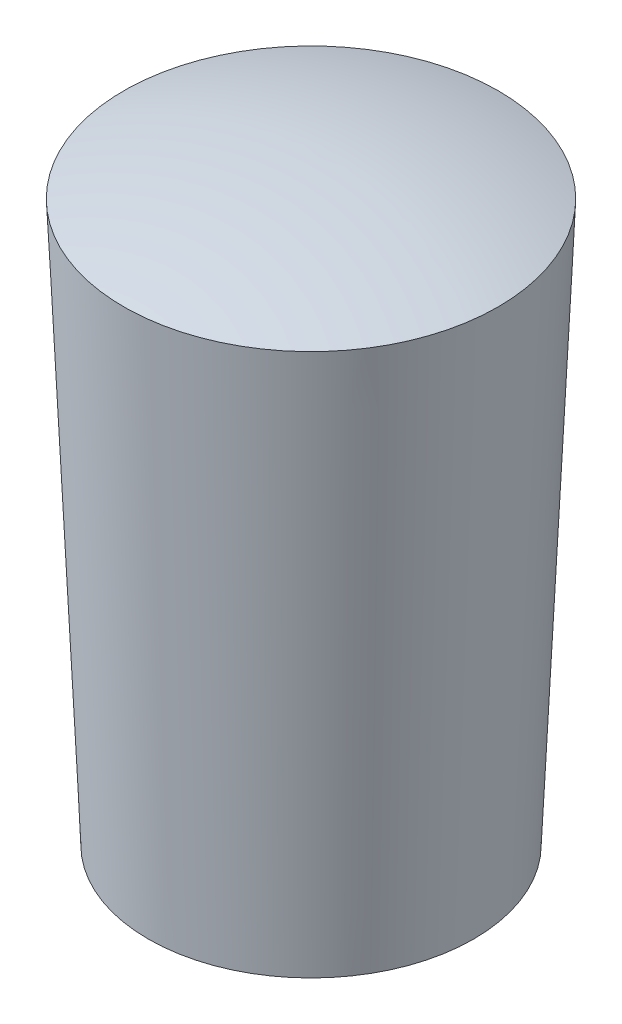
ISO-10303-21;
HEADER;
FILE_DESCRIPTION(('STEP AP214'),'2;1');
FILE_NAME('part.step','',(''),(''),'','','');
FILE_SCHEMA(('AUTOMOTIVE_DESIGN { 1 0 10303 214 1 1 1 1 }'));
ENDSEC;
DATA;
#1=APPLICATION_CONTEXT('core data for automotive mechanical design processes');
#2=APPLICATION_PROTOCOL_DEFINITION('international standard','automotive_design',2000,#1);
#3=PRODUCT_CONTEXT('',#1,'mechanical');
#4=PRODUCT('Part','Part','',(#3));
#5=PRODUCT_RELATED_PRODUCT_CATEGORY('part','',(#4));
#6=PRODUCT_DEFINITION_FORMATION('','',#4);
#7=PRODUCT_DEFINITION_CONTEXT('part definition',#1,'design');
#8=PRODUCT_DEFINITION('design','',#6,#7);
#9=PRODUCT_DEFINITION_SHAPE('','',#8);
#10=(LENGTH_UNIT() NAMED_UNIT(*) SI_UNIT(.MILLI.,.METRE.));
#11=(NAMED_UNIT(*) PLANE_ANGLE_UNIT() SI_UNIT($,.RADIAN.));
#12=(NAMED_UNIT(*) SI_UNIT($,.STERADIAN.) SOLID_ANGLE_UNIT());
#13=UNCERTAINTY_MEASURE_WITH_UNIT(LENGTH_MEASURE(1.E-05),#10,'distance_accuracy_value','');
#14=(GEOMETRIC_REPRESENTATION_CONTEXT(3) GLOBAL_UNCERTAINTY_ASSIGNED_CONTEXT((#13)) GLOBAL_UNIT_ASSIGNED_CONTEXT((#10,
#11,#12)) REPRESENTATION_CONTEXT('',''));
#15=CARTESIAN_POINT('',(0.,0.,0.));
#16=DIRECTION('',(0.,0.,1.));
#17=DIRECTION('',(1.,0.,0.));
#18=AXIS2_PLACEMENT_3D('',#15,#16,#17);
#19=CARTESIAN_POINT('',(0.,0.,0.));
#20=DIRECTION('',(0.,-1.,0.));
#21=DIRECTION('',(1.,0.,0.));
#22=AXIS2_PLACEMENT_3D('',#19,#20,#21);
#23=SPHERICAL_SURFACE('',#22,30.55);
#24=CARTESIAN_POINT('',(0.,28.9725219372231,0.));
#25=DIRECTION('',(0.,-1.,0.));
#26=DIRECTION('',(0.,0.,-1.));
#27=AXIS2_PLACEMENT_3D('',#24,#25,#26);
#28=CIRCLE('',#27,9.6899676262165);
#29=CARTESIAN_POINT('',(0.,28.9725219372231,-9.6899676262165));
#30=VERTEX_POINT('',#29);
#31=EDGE_CURVE('E49',#30,#30,#28,.T.);
#32=ORIENTED_EDGE('',*,*,#31,.F.);
#33=EDGE_LOOP('',(#32));
#34=FACE_BOUND('',#33,.T.);
#35=ADVANCED_FACE('F35',(#34),#23,.T.);
#36=CARTESIAN_POINT('',(0.,0.,0.));
#37=DIRECTION('',(0.,-1.,0.));
#38=DIRECTION('',(1.,0.,0.));
#39=AXIS2_PLACEMENT_3D('',#36,#37,#38);
#40=SPHERICAL_SURFACE('',#39,29.7);
#41=CARTESIAN_POINT('',(0.,28.3624655548854,0.));
#42=DIRECTION('',(0.,-1.,0.));
#43=DIRECTION('',(0.,0.,-1.));
#44=AXIS2_PLACEMENT_3D('',#41,#42,#43);
#45=CIRCLE('',#44,8.81252220694746);
#46=CARTESIAN_POINT('',(0.,28.3624655548854,-8.81252220694746));
#47=VERTEX_POINT('',#46);
#48=EDGE_CURVE('E10',#47,#47,#45,.T.);
#49=ORIENTED_EDGE('',*,*,#48,.T.);
#50=EDGE_LOOP('',(#49));
#51=FACE_BOUND('',#50,.T.);
#52=ADVANCED_FACE('F59',(#51),#40,.F.);
#53=CARTESIAN_POINT('',(0.,0.0370764792605206,0.));
#54=DIRECTION('',(0.,1.,0.));
#55=DIRECTION('',(0.,0.,1.));
#56=AXIS2_PLACEMENT_3D('',#53,#54,#55);
#57=CONICAL_SURFACE('',#56,7.57580901165542,0.043633231299851);
#58=ORIENTED_EDGE('',*,*,#48,.F.);
#59=EDGE_LOOP('',(#58));
#60=FACE_BOUND('',#59,.T.);
#61=CARTESIAN_POINT('',(0.,0.0370764792605206,0.));
#62=DIRECTION('',(0.,-1.,0.));
#63=DIRECTION('',(0.,0.,-1.));
#64=AXIS2_PLACEMENT_3D('',#61,#62,#63);
#65=CIRCLE('',#64,7.57580901165542);
#66=CARTESIAN_POINT('',(0.,0.0370764792605206,-7.57580901165542));
#67=VERTEX_POINT('',#66);
#68=EDGE_CURVE('E41',#67,#67,#65,.T.);
#69=ORIENTED_EDGE('',*,*,#68,.T.);
#70=EDGE_LOOP('',(#69));
#71=FACE_BOUND('',#70,.T.);
#72=ADVANCED_FACE('F63',(#60,#71),#57,.F.);
#73=CARTESIAN_POINT('',(0.,0.,0.));
#74=DIRECTION('',(0.,-1.,0.));
#75=DIRECTION('',(0.,0.,-1.));
#76=AXIS2_PLACEMENT_3D('',#73,#74,#75);
#77=CONICAL_SURFACE('',#76,8.425,1.52716309549506);
#78=ORIENTED_EDGE('',*,*,#68,.F.);
#79=EDGE_LOOP('',(#78));
#80=FACE_BOUND('',#79,.T.);
#81=CARTESIAN_POINT('',(0.,0.,0.));
#82=DIRECTION('',(0.,-1.,0.));
#83=DIRECTION('',(0.,0.,-1.));
#84=AXIS2_PLACEMENT_3D('',#81,#82,#83);
#85=CIRCLE('',#84,8.425);
#86=CARTESIAN_POINT('',(0.,0.,-8.425));
#87=VERTEX_POINT('',#86);
#88=EDGE_CURVE('E45',#87,#87,#85,.T.);
#89=ORIENTED_EDGE('',*,*,#88,.T.);
#90=EDGE_LOOP('',(#89));
#91=FACE_BOUND('',#90,.T.);
#92=ADVANCED_FACE('F67',(#80,#91),#77,.F.);
#93=CARTESIAN_POINT('',(0.,0.,0.));
#94=DIRECTION('',(0.,1.,0.));
#95=DIRECTION('',(0.,0.,1.));
#96=AXIS2_PLACEMENT_3D('',#93,#94,#95);
#97=CONICAL_SURFACE('',#96,8.425,0.043633231299851);
#98=ORIENTED_EDGE('',*,*,#31,.T.);
#99=EDGE_LOOP('',(#98));
#100=FACE_BOUND('',#99,.T.);
#101=ORIENTED_EDGE('',*,*,#88,.F.);
#102=EDGE_LOOP('',(#101));
#103=FACE_BOUND('',#102,.T.);
#104=ADVANCED_FACE('F55',(#100,#103),#97,.T.);
#105=CLOSED_SHELL('',(#35,#52,#72,#92,#104));
#106=MANIFOLD_SOLID_BREP('B2',#105);
#107=ADVANCED_BREP_SHAPE_REPRESENTATION('',(#18,#106),#14);
#108=SHAPE_DEFINITION_REPRESENTATION(#9,#107);
ENDSEC;
END-ISO-10303-21;
